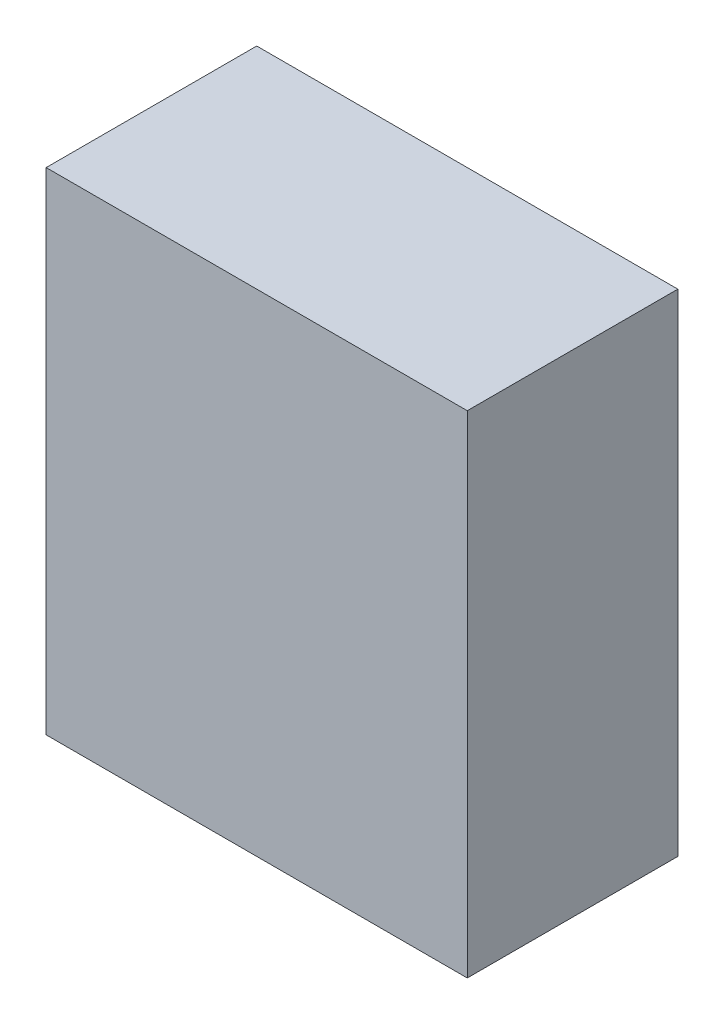
ISO-10303-21;
HEADER;
FILE_DESCRIPTION(('STEP AP214'),'2;1');
FILE_NAME('part.step','',(''),(''),'','','');
FILE_SCHEMA(('AUTOMOTIVE_DESIGN { 1 0 10303 214 1 1 1 1 }'));
ENDSEC;
DATA;
#1=APPLICATION_CONTEXT('core data for automotive mechanical design processes');
#2=APPLICATION_PROTOCOL_DEFINITION('international standard','automotive_design',2000,#1);
#3=PRODUCT_CONTEXT('',#1,'mechanical');
#4=PRODUCT('Part','Part','',(#3));
#5=PRODUCT_RELATED_PRODUCT_CATEGORY('part','',(#4));
#6=PRODUCT_DEFINITION_FORMATION('','',#4);
#7=PRODUCT_DEFINITION_CONTEXT('part definition',#1,'design');
#8=PRODUCT_DEFINITION('design','',#6,#7);
#9=PRODUCT_DEFINITION_SHAPE('','',#8);
#10=(LENGTH_UNIT() NAMED_UNIT(*) SI_UNIT(.MILLI.,.METRE.));
#11=(NAMED_UNIT(*) PLANE_ANGLE_UNIT() SI_UNIT($,.RADIAN.));
#12=(NAMED_UNIT(*) SI_UNIT($,.STERADIAN.) SOLID_ANGLE_UNIT());
#13=UNCERTAINTY_MEASURE_WITH_UNIT(LENGTH_MEASURE(1.E-05),#10,'distance_accuracy_value','');
#14=(GEOMETRIC_REPRESENTATION_CONTEXT(3) GLOBAL_UNCERTAINTY_ASSIGNED_CONTEXT((#13)) GLOBAL_UNIT_ASSIGNED_CONTEXT((#10,
#11,#12)) REPRESENTATION_CONTEXT('',''));
#15=CARTESIAN_POINT('',(0.,0.,0.));
#16=DIRECTION('',(0.,0.,1.));
#17=DIRECTION('',(1.,0.,0.));
#18=AXIS2_PLACEMENT_3D('',#15,#16,#17);
#19=CARTESIAN_POINT('',(30.,35.,30.));
#20=DIRECTION('',(-1.,0.,0.));
#21=DIRECTION('',(0.,0.,1.));
#22=AXIS2_PLACEMENT_3D('',#19,#20,#21);
#23=PLANE('',#22);
#24=DIRECTION('',(0.,1.,0.));
#25=VECTOR('',#24,1.);
#26=CARTESIAN_POINT('',(30.,35.,0.));
#27=LINE('',#26,#25);
#28=CARTESIAN_POINT('',(30.,-35.,0.));
#29=VERTEX_POINT('',#28);
#30=CARTESIAN_POINT('',(30.,35.,0.));
#31=VERTEX_POINT('',#30);
#32=EDGE_CURVE('E141',#29,#31,#27,.T.);
#33=ORIENTED_EDGE('',*,*,#32,.T.);
#34=DIRECTION('',(0.,0.,-1.));
#35=VECTOR('',#34,1.);
#36=CARTESIAN_POINT('',(30.,35.,30.));
#37=LINE('',#36,#35);
#38=CARTESIAN_POINT('',(30.,35.,30.));
#39=VERTEX_POINT('',#38);
#40=EDGE_CURVE('E132',#39,#31,#37,.T.);
#41=ORIENTED_EDGE('',*,*,#40,.F.);
#42=DIRECTION('',(0.,1.,0.));
#43=VECTOR('',#42,1.);
#44=CARTESIAN_POINT('',(30.,35.,30.));
#45=LINE('',#44,#43);
#46=CARTESIAN_POINT('',(30.,-35.,30.));
#47=VERTEX_POINT('',#46);
#48=EDGE_CURVE('E126',#47,#39,#45,.T.);
#49=ORIENTED_EDGE('',*,*,#48,.F.);
#50=DIRECTION('',(0.,0.,-1.));
#51=VECTOR('',#50,1.);
#52=CARTESIAN_POINT('',(30.,-35.,30.));
#53=LINE('',#52,#51);
#54=EDGE_CURVE('E137',#47,#29,#53,.T.);
#55=ORIENTED_EDGE('',*,*,#54,.T.);
#56=EDGE_LOOP('',(#33,#41,#49,#55));
#57=FACE_BOUND('',#56,.T.);
#58=ADVANCED_FACE('F35',(#57),#23,.F.);
#59=CARTESIAN_POINT('',(-30.,35.,30.));
#60=DIRECTION('',(0.,-1.,0.));
#61=DIRECTION('',(0.,0.,-1.));
#62=AXIS2_PLACEMENT_3D('',#59,#60,#61);
#63=PLANE('',#62);
#64=DIRECTION('',(-1.,0.,0.));
#65=VECTOR('',#64,1.);
#66=CARTESIAN_POINT('',(-30.,35.,0.));
#67=LINE('',#66,#65);
#68=CARTESIAN_POINT('',(-30.,35.,0.));
#69=VERTEX_POINT('',#68);
#70=EDGE_CURVE('E131',#31,#69,#67,.T.);
#71=ORIENTED_EDGE('',*,*,#70,.T.);
#72=DIRECTION('',(0.,0.,-1.));
#73=VECTOR('',#72,1.);
#74=CARTESIAN_POINT('',(-30.,35.,30.));
#75=LINE('',#74,#73);
#76=CARTESIAN_POINT('',(-30.,35.,30.));
#77=VERTEX_POINT('',#76);
#78=EDGE_CURVE('E129',#77,#69,#75,.T.);
#79=ORIENTED_EDGE('',*,*,#78,.F.);
#80=DIRECTION('',(-1.,0.,0.));
#81=VECTOR('',#80,1.);
#82=CARTESIAN_POINT('',(-30.,35.,30.));
#83=LINE('',#82,#81);
#84=EDGE_CURVE('E121',#39,#77,#83,.T.);
#85=ORIENTED_EDGE('',*,*,#84,.F.);
#86=ORIENTED_EDGE('',*,*,#40,.T.);
#87=EDGE_LOOP('',(#71,#79,#85,#86));
#88=FACE_BOUND('',#87,.T.);
#89=ADVANCED_FACE('F130',(#88),#63,.F.);
#90=CARTESIAN_POINT('',(-30.,35.,30.));
#91=DIRECTION('',(1.,0.,0.));
#92=DIRECTION('',(0.,0.,-1.));
#93=AXIS2_PLACEMENT_3D('',#90,#91,#92);
#94=PLANE('',#93);
#95=DIRECTION('',(0.,-1.,0.));
#96=VECTOR('',#95,1.);
#97=CARTESIAN_POINT('',(-30.,35.,0.));
#98=LINE('',#97,#96);
#99=CARTESIAN_POINT('',(-30.,-35.,0.));
#100=VERTEX_POINT('',#99);
#101=EDGE_CURVE('E107',#69,#100,#98,.T.);
#102=ORIENTED_EDGE('',*,*,#101,.T.);
#103=DIRECTION('',(0.,0.,-1.));
#104=VECTOR('',#103,1.);
#105=CARTESIAN_POINT('',(-30.,-35.,30.));
#106=LINE('',#105,#104);
#107=CARTESIAN_POINT('',(-30.,-35.,30.));
#108=VERTEX_POINT('',#107);
#109=EDGE_CURVE('E133',#108,#100,#106,.T.);
#110=ORIENTED_EDGE('',*,*,#109,.F.);
#111=DIRECTION('',(0.,-1.,0.));
#112=VECTOR('',#111,1.);
#113=CARTESIAN_POINT('',(-30.,35.,30.));
#114=LINE('',#113,#112);
#115=EDGE_CURVE('E124',#77,#108,#114,.T.);
#116=ORIENTED_EDGE('',*,*,#115,.F.);
#117=ORIENTED_EDGE('',*,*,#78,.T.);
#118=EDGE_LOOP('',(#102,#110,#116,#117));
#119=FACE_BOUND('',#118,.T.);
#120=ADVANCED_FACE('F135',(#119),#94,.F.);
#121=CARTESIAN_POINT('',(-30.,-35.,30.));
#122=DIRECTION('',(0.,1.,0.));
#123=DIRECTION('',(0.,0.,1.));
#124=AXIS2_PLACEMENT_3D('',#121,#122,#123);
#125=PLANE('',#124);
#126=DIRECTION('',(1.,0.,0.));
#127=VECTOR('',#126,1.);
#128=CARTESIAN_POINT('',(-30.,-35.,0.));
#129=LINE('',#128,#127);
#130=EDGE_CURVE('E113',#100,#29,#129,.T.);
#131=ORIENTED_EDGE('',*,*,#130,.T.);
#132=ORIENTED_EDGE('',*,*,#54,.F.);
#133=DIRECTION('',(1.,0.,0.));
#134=VECTOR('',#133,1.);
#135=CARTESIAN_POINT('',(-30.,-35.,30.));
#136=LINE('',#135,#134);
#137=EDGE_CURVE('E90',#108,#47,#136,.T.);
#138=ORIENTED_EDGE('',*,*,#137,.F.);
#139=ORIENTED_EDGE('',*,*,#109,.T.);
#140=EDGE_LOOP('',(#131,#132,#138,#139));
#141=FACE_BOUND('',#140,.T.);
#142=ADVANCED_FACE('F205',(#141),#125,.F.);
#143=CARTESIAN_POINT('',(0.,0.,30.));
#144=DIRECTION('',(0.,0.,1.));
#145=DIRECTION('',(1.,0.,0.));
#146=AXIS2_PLACEMENT_3D('',#143,#144,#145);
#147=PLANE('',#146);
#148=ORIENTED_EDGE('',*,*,#48,.T.);
#149=ORIENTED_EDGE('',*,*,#84,.T.);
#150=ORIENTED_EDGE('',*,*,#115,.T.);
#151=ORIENTED_EDGE('',*,*,#137,.T.);
#152=EDGE_LOOP('',(#148,#149,#150,#151));
#153=FACE_BOUND('',#152,.T.);
#154=ADVANCED_FACE('F122',(#153),#147,.T.);
#155=CARTESIAN_POINT('',(0.,0.,0.));
#156=DIRECTION('',(0.,0.,1.));
#157=DIRECTION('',(1.,0.,0.));
#158=AXIS2_PLACEMENT_3D('',#155,#156,#157);
#159=PLANE('',#158);
#160=ORIENTED_EDGE('',*,*,#32,.F.);
#161=ORIENTED_EDGE('',*,*,#130,.F.);
#162=ORIENTED_EDGE('',*,*,#101,.F.);
#163=ORIENTED_EDGE('',*,*,#70,.F.);
#164=EDGE_LOOP('',(#160,#161,#162,#163));
#165=FACE_BOUND('',#164,.T.);
#166=ADVANCED_FACE('F208',(#165),#159,.F.);
#167=CLOSED_SHELL('',(#58,#89,#120,#142,#154,#166));
#168=CARTESIAN_POINT('',(27.5,35.,30.));
#169=DIRECTION('',(-1.,0.,0.));
#170=DIRECTION('',(0.,0.,1.));
#171=AXIS2_PLACEMENT_3D('',#168,#169,#170);
#172=PLANE('',#171);
#173=DIRECTION('',(0.,1.,0.));
#174=VECTOR('',#173,1.);
#175=CARTESIAN_POINT('',(27.5,35.,2.5));
#176=LINE('',#175,#174);
#177=CARTESIAN_POINT('',(27.5,-32.5,2.5));
#178=VERTEX_POINT('',#177);
#179=CARTESIAN_POINT('',(27.5,32.5,2.5));
#180=VERTEX_POINT('',#179);
#181=EDGE_CURVE('E39',#178,#180,#176,.T.);
#182=ORIENTED_EDGE('',*,*,#181,.F.);
#183=DIRECTION('',(0.,0.,-1.));
#184=VECTOR('',#183,1.);
#185=CARTESIAN_POINT('',(27.5,-32.5,30.));
#186=LINE('',#185,#184);
#187=CARTESIAN_POINT('',(27.5,-32.5,27.5));
#188=VERTEX_POINT('',#187);
#189=EDGE_CURVE('E165',#188,#178,#186,.T.);
#190=ORIENTED_EDGE('',*,*,#189,.F.);
#191=DIRECTION('',(0.,1.,0.));
#192=VECTOR('',#191,1.);
#193=CARTESIAN_POINT('',(27.5,35.,27.5));
#194=LINE('',#193,#192);
#195=CARTESIAN_POINT('',(27.5,32.5,27.5));
#196=VERTEX_POINT('',#195);
#197=EDGE_CURVE('E152',#188,#196,#194,.T.);
#198=ORIENTED_EDGE('',*,*,#197,.T.);
#199=DIRECTION('',(0.,0.,-1.));
#200=VECTOR('',#199,1.);
#201=CARTESIAN_POINT('',(27.5,32.5,30.));
#202=LINE('',#201,#200);
#203=EDGE_CURVE('E163',#196,#180,#202,.T.);
#204=ORIENTED_EDGE('',*,*,#203,.T.);
#205=EDGE_LOOP('',(#182,#190,#198,#204));
#206=FACE_BOUND('',#205,.T.);
#207=ADVANCED_FACE('F172',(#206),#172,.T.);
#208=CARTESIAN_POINT('',(-30.,32.5,30.));
#209=DIRECTION('',(0.,-1.,0.));
#210=DIRECTION('',(0.,0.,-1.));
#211=AXIS2_PLACEMENT_3D('',#208,#209,#210);
#212=PLANE('',#211);
#213=DIRECTION('',(-1.,0.,0.));
#214=VECTOR('',#213,1.);
#215=CARTESIAN_POINT('',(-30.,32.5,2.5));
#216=LINE('',#215,#214);
#217=CARTESIAN_POINT('',(-27.5,32.5,2.5));
#218=VERTEX_POINT('',#217);
#219=EDGE_CURVE('E55',#180,#218,#216,.T.);
#220=ORIENTED_EDGE('',*,*,#219,.F.);
#221=ORIENTED_EDGE('',*,*,#203,.F.);
#222=DIRECTION('',(-1.,0.,0.));
#223=VECTOR('',#222,1.);
#224=CARTESIAN_POINT('',(-30.,32.5,27.5));
#225=LINE('',#224,#223);
#226=CARTESIAN_POINT('',(-27.5,32.5,27.5));
#227=VERTEX_POINT('',#226);
#228=EDGE_CURVE('E78',#196,#227,#225,.T.);
#229=ORIENTED_EDGE('',*,*,#228,.T.);
#230=DIRECTION('',(0.,0.,-1.));
#231=VECTOR('',#230,1.);
#232=CARTESIAN_POINT('',(-27.5,32.5,30.));
#233=LINE('',#232,#231);
#234=EDGE_CURVE('E159',#227,#218,#233,.T.);
#235=ORIENTED_EDGE('',*,*,#234,.T.);
#236=EDGE_LOOP('',(#220,#221,#229,#235));
#237=FACE_BOUND('',#236,.T.);
#238=ADVANCED_FACE('F173',(#237),#212,.T.);
#239=CARTESIAN_POINT('',(-27.5,35.,30.));
#240=DIRECTION('',(1.,0.,0.));
#241=DIRECTION('',(0.,0.,-1.));
#242=AXIS2_PLACEMENT_3D('',#239,#240,#241);
#243=PLANE('',#242);
#244=DIRECTION('',(0.,-1.,0.));
#245=VECTOR('',#244,1.);
#246=CARTESIAN_POINT('',(-27.5,35.,2.5));
#247=LINE('',#246,#245);
#248=CARTESIAN_POINT('',(-27.5,-32.5,2.5));
#249=VERTEX_POINT('',#248);
#250=EDGE_CURVE('E161',#218,#249,#247,.T.);
#251=ORIENTED_EDGE('',*,*,#250,.F.);
#252=ORIENTED_EDGE('',*,*,#234,.F.);
#253=DIRECTION('',(0.,-1.,0.));
#254=VECTOR('',#253,1.);
#255=CARTESIAN_POINT('',(-27.5,35.,27.5));
#256=LINE('',#255,#254);
#257=CARTESIAN_POINT('',(-27.5,-32.5,27.5));
#258=VERTEX_POINT('',#257);
#259=EDGE_CURVE('E46',#227,#258,#256,.T.);
#260=ORIENTED_EDGE('',*,*,#259,.T.);
#261=DIRECTION('',(0.,0.,-1.));
#262=VECTOR('',#261,1.);
#263=CARTESIAN_POINT('',(-27.5,-32.5,30.));
#264=LINE('',#263,#262);
#265=EDGE_CURVE('E154',#258,#249,#264,.T.);
#266=ORIENTED_EDGE('',*,*,#265,.T.);
#267=EDGE_LOOP('',(#251,#252,#260,#266));
#268=FACE_BOUND('',#267,.T.);
#269=ADVANCED_FACE('F177',(#268),#243,.T.);
#270=CARTESIAN_POINT('',(-30.,-32.5,30.));
#271=DIRECTION('',(0.,1.,0.));
#272=DIRECTION('',(0.,0.,1.));
#273=AXIS2_PLACEMENT_3D('',#270,#271,#272);
#274=PLANE('',#273);
#275=DIRECTION('',(1.,0.,0.));
#276=VECTOR('',#275,1.);
#277=CARTESIAN_POINT('',(-30.,-32.5,2.5));
#278=LINE('',#277,#276);
#279=EDGE_CURVE('E157',#249,#178,#278,.T.);
#280=ORIENTED_EDGE('',*,*,#279,.F.);
#281=ORIENTED_EDGE('',*,*,#265,.F.);
#282=DIRECTION('',(1.,0.,0.));
#283=VECTOR('',#282,1.);
#284=CARTESIAN_POINT('',(-30.,-32.5,27.5));
#285=LINE('',#284,#283);
#286=EDGE_CURVE('E11',#258,#188,#285,.T.);
#287=ORIENTED_EDGE('',*,*,#286,.T.);
#288=ORIENTED_EDGE('',*,*,#189,.T.);
#289=EDGE_LOOP('',(#280,#281,#287,#288));
#290=FACE_BOUND('',#289,.T.);
#291=ADVANCED_FACE('F181',(#290),#274,.T.);
#292=CARTESIAN_POINT('',(0.,0.,27.5));
#293=DIRECTION('',(0.,0.,1.));
#294=DIRECTION('',(1.,0.,0.));
#295=AXIS2_PLACEMENT_3D('',#292,#293,#294);
#296=PLANE('',#295);
#297=ORIENTED_EDGE('',*,*,#197,.F.);
#298=ORIENTED_EDGE('',*,*,#286,.F.);
#299=ORIENTED_EDGE('',*,*,#259,.F.);
#300=ORIENTED_EDGE('',*,*,#228,.F.);
#301=EDGE_LOOP('',(#297,#298,#299,#300));
#302=FACE_BOUND('',#301,.T.);
#303=ADVANCED_FACE('F180',(#302),#296,.F.);
#304=CARTESIAN_POINT('',(0.,0.,2.5));
#305=DIRECTION('',(0.,0.,1.));
#306=DIRECTION('',(1.,0.,0.));
#307=AXIS2_PLACEMENT_3D('',#304,#305,#306);
#308=PLANE('',#307);
#309=ORIENTED_EDGE('',*,*,#181,.T.);
#310=ORIENTED_EDGE('',*,*,#219,.T.);
#311=ORIENTED_EDGE('',*,*,#250,.T.);
#312=ORIENTED_EDGE('',*,*,#279,.T.);
#313=EDGE_LOOP('',(#309,#310,#311,#312));
#314=FACE_BOUND('',#313,.T.);
#315=ADVANCED_FACE('F37',(#314),#308,.T.);
#316=CLOSED_SHELL('',(#207,#238,#269,#291,#303,#315));
#317=ORIENTED_CLOSED_SHELL('',*,#316,.T.);
#318=BREP_WITH_VOIDS('B2',#167,(#317));
#319=ADVANCED_BREP_SHAPE_REPRESENTATION('',(#18,#318),#14);
#320=SHAPE_DEFINITION_REPRESENTATION(#9,#319);
ENDSEC;
END-ISO-10303-21;
